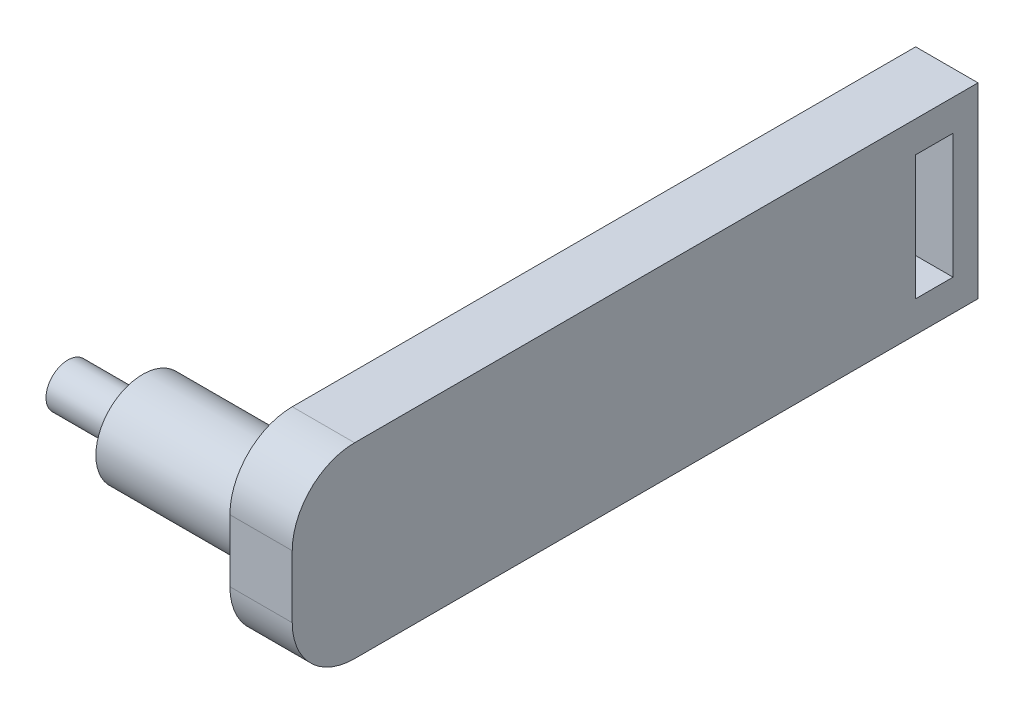
ISO-10303-21;
HEADER;
FILE_DESCRIPTION(('STEP AP214'),'2;1');
FILE_NAME('part.step','',(''),(''),'','','');
FILE_SCHEMA(('AUTOMOTIVE_DESIGN { 1 0 10303 214 1 1 1 1 }'));
ENDSEC;
DATA;
#1=APPLICATION_CONTEXT('core data for automotive mechanical design processes');
#2=APPLICATION_PROTOCOL_DEFINITION('international standard','automotive_design',2000,#1);
#3=PRODUCT_CONTEXT('',#1,'mechanical');
#4=PRODUCT('Part','Part','',(#3));
#5=PRODUCT_RELATED_PRODUCT_CATEGORY('part','',(#4));
#6=PRODUCT_DEFINITION_FORMATION('','',#4);
#7=PRODUCT_DEFINITION_CONTEXT('part definition',#1,'design');
#8=PRODUCT_DEFINITION('design','',#6,#7);
#9=PRODUCT_DEFINITION_SHAPE('','',#8);
#10=(LENGTH_UNIT() NAMED_UNIT(*) SI_UNIT(.MILLI.,.METRE.));
#11=(NAMED_UNIT(*) PLANE_ANGLE_UNIT() SI_UNIT($,.RADIAN.));
#12=(NAMED_UNIT(*) SI_UNIT($,.STERADIAN.) SOLID_ANGLE_UNIT());
#13=UNCERTAINTY_MEASURE_WITH_UNIT(LENGTH_MEASURE(1.E-05),#10,'distance_accuracy_value','');
#14=(GEOMETRIC_REPRESENTATION_CONTEXT(3) GLOBAL_UNCERTAINTY_ASSIGNED_CONTEXT((#13)) GLOBAL_UNIT_ASSIGNED_CONTEXT((#10,
#11,#12)) REPRESENTATION_CONTEXT('',''));
#15=CARTESIAN_POINT('',(0.,0.,0.));
#16=DIRECTION('',(0.,0.,1.));
#17=DIRECTION('',(1.,0.,0.));
#18=AXIS2_PLACEMENT_3D('',#15,#16,#17);
#19=CARTESIAN_POINT('',(0.,15.,26.2097315436242));
#20=DIRECTION('',(0.,0.,-1.));
#21=DIRECTION('',(-1.,0.,0.));
#22=AXIS2_PLACEMENT_3D('',#19,#20,#21);
#23=PLANE('',#22);
#24=DIRECTION('',(0.,-1.,0.));
#25=VECTOR('',#24,1.);
#26=CARTESIAN_POINT('',(-56.8805369127517,15.,26.2097315436242));
#27=LINE('',#26,#25);
#28=CARTESIAN_POINT('',(-56.8805369127517,10.,26.2097315436242));
#29=VERTEX_POINT('',#28);
#30=CARTESIAN_POINT('',(-56.8805369127517,5.,26.2097315436242));
#31=VERTEX_POINT('',#30);
#32=EDGE_CURVE('E191',#29,#31,#27,.T.);
#33=ORIENTED_EDGE('',*,*,#32,.F.);
#34=DIRECTION('',(1.,0.,0.));
#35=VECTOR('',#34,1.);
#36=CARTESIAN_POINT('',(-61.8805369127517,10.,26.2097315436242));
#37=LINE('',#36,#35);
#38=CARTESIAN_POINT('',(-61.8805369127517,10.,26.2097315436242));
#39=VERTEX_POINT('',#38);
#40=EDGE_CURVE('E209',#29,#39,#37,.F.);
#41=ORIENTED_EDGE('',*,*,#40,.T.);
#42=DIRECTION('',(0.,-1.,0.));
#43=VECTOR('',#42,1.);
#44=CARTESIAN_POINT('',(-61.8805369127517,15.,26.2097315436242));
#45=LINE('',#44,#43);
#46=CARTESIAN_POINT('',(-61.8805369127517,5.,26.2097315436242));
#47=VERTEX_POINT('',#46);
#48=EDGE_CURVE('E171',#39,#47,#45,.T.);
#49=ORIENTED_EDGE('',*,*,#48,.T.);
#50=DIRECTION('',(1.,0.,0.));
#51=VECTOR('',#50,1.);
#52=CARTESIAN_POINT('',(0.,5.,26.2097315436242));
#53=LINE('',#52,#51);
#54=EDGE_CURVE('E205',#47,#31,#53,.T.);
#55=ORIENTED_EDGE('',*,*,#54,.T.);
#56=EDGE_LOOP('',(#33,#41,#49,#55));
#57=FACE_BOUND('',#56,.T.);
#58=ADVANCED_FACE('F41',(#57),#23,.F.);
#59=CARTESIAN_POINT('',(-56.8805369127517,15.,0.));
#60=DIRECTION('',(-1.,0.,0.));
#61=DIRECTION('',(0.,0.,1.));
#62=AXIS2_PLACEMENT_3D('',#59,#60,#61);
#63=PLANE('',#62);
#64=DIRECTION('',(0.,0.,1.));
#65=VECTOR('',#64,1.);
#66=CARTESIAN_POINT('',(-56.8805369127517,12.5,-26.7902684563758));
#67=LINE('',#66,#65);
#68=CARTESIAN_POINT('',(-56.8805369127517,12.5,-26.7902684563758));
#69=VERTEX_POINT('',#68);
#70=CARTESIAN_POINT('',(-56.8805369127517,12.5,-23.7902684563758));
#71=VERTEX_POINT('',#70);
#72=EDGE_CURVE('E314',#69,#71,#67,.T.);
#73=ORIENTED_EDGE('',*,*,#72,.F.);
#74=DIRECTION('',(0.,1.,0.));
#75=VECTOR('',#74,1.);
#76=CARTESIAN_POINT('',(-56.8805369127517,2.5,-26.7902684563758));
#77=LINE('',#76,#75);
#78=CARTESIAN_POINT('',(-56.8805369127517,2.5,-26.7902684563758));
#79=VERTEX_POINT('',#78);
#80=EDGE_CURVE('E159',#79,#69,#77,.T.);
#81=ORIENTED_EDGE('',*,*,#80,.F.);
#82=DIRECTION('',(0.,0.,-1.));
#83=VECTOR('',#82,1.);
#84=CARTESIAN_POINT('',(-56.8805369127517,2.5,-26.7902684563758));
#85=LINE('',#84,#83);
#86=CARTESIAN_POINT('',(-56.8805369127517,2.5,-23.7902684563758));
#87=VERTEX_POINT('',#86);
#88=EDGE_CURVE('E155',#87,#79,#85,.T.);
#89=ORIENTED_EDGE('',*,*,#88,.F.);
#90=DIRECTION('',(0.,-1.,0.));
#91=VECTOR('',#90,1.);
#92=CARTESIAN_POINT('',(-56.8805369127517,2.5,-23.7902684563758));
#93=LINE('',#92,#91);
#94=EDGE_CURVE('E126',#71,#87,#93,.T.);
#95=ORIENTED_EDGE('',*,*,#94,.F.);
#96=EDGE_LOOP('',(#73,#81,#89,#95));
#97=FACE_BOUND('',#96,.T.);
#98=DIRECTION('',(0.,0.,-1.));
#99=VECTOR('',#98,1.);
#100=CARTESIAN_POINT('',(-56.8805369127517,15.,0.));
#101=LINE('',#100,#99);
#102=CARTESIAN_POINT('',(-56.8805369127517,15.,21.2097315436242));
#103=VERTEX_POINT('',#102);
#104=CARTESIAN_POINT('',(-56.8805369127517,15.,-28.7902684563758));
#105=VERTEX_POINT('',#104);
#106=EDGE_CURVE('E160',#103,#105,#101,.T.);
#107=ORIENTED_EDGE('',*,*,#106,.F.);
#108=CARTESIAN_POINT('',(-56.8805369127517,10.,21.2097315436242));
#109=DIRECTION('',(-1.,0.,0.));
#110=DIRECTION('',(0.,0.,1.));
#111=AXIS2_PLACEMENT_3D('',#108,#109,#110);
#112=CIRCLE('',#111,5.);
#113=EDGE_CURVE('E202',#103,#29,#112,.F.);
#114=ORIENTED_EDGE('',*,*,#113,.T.);
#115=ORIENTED_EDGE('',*,*,#32,.T.);
#116=CARTESIAN_POINT('',(-56.8805369127517,5.,21.2097315436242));
#117=DIRECTION('',(-1.,0.,0.));
#118=DIRECTION('',(0.,0.,1.));
#119=AXIS2_PLACEMENT_3D('',#116,#117,#118);
#120=CIRCLE('',#119,5.);
#121=CARTESIAN_POINT('',(-56.8805369127517,0.,21.2097315436242));
#122=VERTEX_POINT('',#121);
#123=EDGE_CURVE('E199',#31,#122,#120,.F.);
#124=ORIENTED_EDGE('',*,*,#123,.T.);
#125=DIRECTION('',(0.,0.,-1.));
#126=VECTOR('',#125,1.);
#127=CARTESIAN_POINT('',(-56.8805369127517,0.,0.));
#128=LINE('',#127,#126);
#129=CARTESIAN_POINT('',(-56.8805369127517,0.,-28.7902684563758));
#130=VERTEX_POINT('',#129);
#131=EDGE_CURVE('E158',#122,#130,#128,.T.);
#132=ORIENTED_EDGE('',*,*,#131,.T.);
#133=DIRECTION('',(0.,-1.,0.));
#134=VECTOR('',#133,1.);
#135=CARTESIAN_POINT('',(-56.8805369127517,15.,-28.7902684563758));
#136=LINE('',#135,#134);
#137=EDGE_CURVE('E187',#105,#130,#136,.T.);
#138=ORIENTED_EDGE('',*,*,#137,.F.);
#139=EDGE_LOOP('',(#107,#114,#115,#124,#132,#138));
#140=FACE_BOUND('',#139,.T.);
#141=ADVANCED_FACE('F235',(#97,#140),#63,.F.);
#142=CARTESIAN_POINT('',(0.,15.,-28.7902684563758));
#143=DIRECTION('',(0.,0.,-1.));
#144=DIRECTION('',(-1.,0.,0.));
#145=AXIS2_PLACEMENT_3D('',#142,#143,#144);
#146=PLANE('',#145);
#147=DIRECTION('',(1.,0.,0.));
#148=VECTOR('',#147,1.);
#149=CARTESIAN_POINT('',(0.,0.,-28.7902684563758));
#150=LINE('',#149,#148);
#151=CARTESIAN_POINT('',(-61.8805369127517,0.,-28.7902684563758));
#152=VERTEX_POINT('',#151);
#153=EDGE_CURVE('E174',#152,#130,#150,.T.);
#154=ORIENTED_EDGE('',*,*,#153,.F.);
#155=DIRECTION('',(0.,-1.,0.));
#156=VECTOR('',#155,1.);
#157=CARTESIAN_POINT('',(-61.8805369127517,15.,-28.7902684563758));
#158=LINE('',#157,#156);
#159=CARTESIAN_POINT('',(-61.8805369127517,15.,-28.7902684563758));
#160=VERTEX_POINT('',#159);
#161=EDGE_CURVE('E183',#160,#152,#158,.T.);
#162=ORIENTED_EDGE('',*,*,#161,.F.);
#163=DIRECTION('',(1.,0.,0.));
#164=VECTOR('',#163,1.);
#165=CARTESIAN_POINT('',(0.,15.,-28.7902684563758));
#166=LINE('',#165,#164);
#167=EDGE_CURVE('E163',#160,#105,#166,.T.);
#168=ORIENTED_EDGE('',*,*,#167,.T.);
#169=ORIENTED_EDGE('',*,*,#137,.T.);
#170=EDGE_LOOP('',(#154,#162,#168,#169));
#171=FACE_BOUND('',#170,.T.);
#172=ADVANCED_FACE('F244',(#171),#146,.T.);
#173=CARTESIAN_POINT('',(-61.8805369127517,15.,0.));
#174=DIRECTION('',(-1.,0.,0.));
#175=DIRECTION('',(0.,0.,1.));
#176=AXIS2_PLACEMENT_3D('',#173,#174,#175);
#177=PLANE('',#176);
#178=CARTESIAN_POINT('',(-61.8805369127517,7.5,21.2097315436242));
#179=DIRECTION('',(-1.,0.,0.));
#180=DIRECTION('',(0.,0.,1.));
#181=AXIS2_PLACEMENT_3D('',#178,#179,#180);
#182=CIRCLE('',#181,3.75);
#183=CARTESIAN_POINT('',(-61.8805369127517,7.5,24.9597315436242));
#184=VERTEX_POINT('',#183);
#185=EDGE_CURVE('E302',#184,#184,#182,.T.);
#186=ORIENTED_EDGE('',*,*,#185,.F.);
#187=EDGE_LOOP('',(#186));
#188=FACE_BOUND('',#187,.T.);
#189=DIRECTION('',(0.,-1.,0.));
#190=VECTOR('',#189,1.);
#191=CARTESIAN_POINT('',(-61.8805369127517,2.5,-26.7902684563758));
#192=LINE('',#191,#190);
#193=CARTESIAN_POINT('',(-61.8805369127517,12.5,-26.7902684563758));
#194=VERTEX_POINT('',#193);
#195=CARTESIAN_POINT('',(-61.8805369127517,2.5,-26.7902684563758));
#196=VERTEX_POINT('',#195);
#197=EDGE_CURVE('E66',#194,#196,#192,.T.);
#198=ORIENTED_EDGE('',*,*,#197,.F.);
#199=DIRECTION('',(0.,0.,-1.));
#200=VECTOR('',#199,1.);
#201=CARTESIAN_POINT('',(-61.8805369127517,12.5,-26.7902684563758));
#202=LINE('',#201,#200);
#203=CARTESIAN_POINT('',(-61.8805369127517,12.5,-23.7902684563758));
#204=VERTEX_POINT('',#203);
#205=EDGE_CURVE('E141',#204,#194,#202,.T.);
#206=ORIENTED_EDGE('',*,*,#205,.F.);
#207=DIRECTION('',(0.,1.,0.));
#208=VECTOR('',#207,1.);
#209=CARTESIAN_POINT('',(-61.8805369127517,2.5,-23.7902684563758));
#210=LINE('',#209,#208);
#211=CARTESIAN_POINT('',(-61.8805369127517,2.5,-23.7902684563758));
#212=VERTEX_POINT('',#211);
#213=EDGE_CURVE('E123',#212,#204,#210,.T.);
#214=ORIENTED_EDGE('',*,*,#213,.F.);
#215=DIRECTION('',(0.,0.,1.));
#216=VECTOR('',#215,1.);
#217=CARTESIAN_POINT('',(-61.8805369127517,2.5,-26.7902684563758));
#218=LINE('',#217,#216);
#219=EDGE_CURVE('E133',#196,#212,#218,.T.);
#220=ORIENTED_EDGE('',*,*,#219,.F.);
#221=EDGE_LOOP('',(#198,#206,#214,#220));
#222=FACE_BOUND('',#221,.T.);
#223=ORIENTED_EDGE('',*,*,#48,.F.);
#224=CARTESIAN_POINT('',(-61.8805369127517,10.,21.2097315436242));
#225=DIRECTION('',(-1.,0.,0.));
#226=DIRECTION('',(0.,0.,1.));
#227=AXIS2_PLACEMENT_3D('',#224,#225,#226);
#228=CIRCLE('',#227,5.);
#229=CARTESIAN_POINT('',(-61.8805369127517,15.,21.2097315436242));
#230=VERTEX_POINT('',#229);
#231=EDGE_CURVE('E214',#39,#230,#228,.T.);
#232=ORIENTED_EDGE('',*,*,#231,.T.);
#233=DIRECTION('',(0.,0.,-1.));
#234=VECTOR('',#233,1.);
#235=CARTESIAN_POINT('',(-61.8805369127517,15.,0.));
#236=LINE('',#235,#234);
#237=EDGE_CURVE('E168',#230,#160,#236,.T.);
#238=ORIENTED_EDGE('',*,*,#237,.T.);
#239=ORIENTED_EDGE('',*,*,#161,.T.);
#240=DIRECTION('',(0.,0.,-1.));
#241=VECTOR('',#240,1.);
#242=CARTESIAN_POINT('',(-61.8805369127517,0.,0.));
#243=LINE('',#242,#241);
#244=CARTESIAN_POINT('',(-61.8805369127517,0.,21.2097315436242));
#245=VERTEX_POINT('',#244);
#246=EDGE_CURVE('E164',#245,#152,#243,.T.);
#247=ORIENTED_EDGE('',*,*,#246,.F.);
#248=CARTESIAN_POINT('',(-61.8805369127517,5.,21.2097315436242));
#249=DIRECTION('',(-1.,0.,0.));
#250=DIRECTION('',(0.,0.,1.));
#251=AXIS2_PLACEMENT_3D('',#248,#249,#250);
#252=CIRCLE('',#251,5.);
#253=EDGE_CURVE('E212',#245,#47,#252,.T.);
#254=ORIENTED_EDGE('',*,*,#253,.T.);
#255=EDGE_LOOP('',(#223,#232,#238,#239,#247,#254));
#256=FACE_BOUND('',#255,.T.);
#257=ADVANCED_FACE('F138',(#188,#222,#256),#177,.T.);
#258=CARTESIAN_POINT('',(0.,15.,0.));
#259=DIRECTION('',(0.,1.,0.));
#260=DIRECTION('',(0.,0.,1.));
#261=AXIS2_PLACEMENT_3D('',#258,#259,#260);
#262=PLANE('',#261);
#263=ORIENTED_EDGE('',*,*,#237,.F.);
#264=DIRECTION('',(1.,0.,0.));
#265=VECTOR('',#264,1.);
#266=CARTESIAN_POINT('',(-56.8805369127517,15.,21.2097315436242));
#267=LINE('',#266,#265);
#268=EDGE_CURVE('E195',#230,#103,#267,.T.);
#269=ORIENTED_EDGE('',*,*,#268,.T.);
#270=ORIENTED_EDGE('',*,*,#106,.T.);
#271=ORIENTED_EDGE('',*,*,#167,.F.);
#272=EDGE_LOOP('',(#263,#269,#270,#271));
#273=FACE_BOUND('',#272,.T.);
#274=ADVANCED_FACE('F241',(#273),#262,.T.);
#275=CARTESIAN_POINT('',(0.,0.,0.));
#276=DIRECTION('',(0.,1.,0.));
#277=DIRECTION('',(0.,0.,1.));
#278=AXIS2_PLACEMENT_3D('',#275,#276,#277);
#279=PLANE('',#278);
#280=ORIENTED_EDGE('',*,*,#131,.F.);
#281=DIRECTION('',(1.,0.,0.));
#282=VECTOR('',#281,1.);
#283=CARTESIAN_POINT('',(0.,0.,21.2097315436242));
#284=LINE('',#283,#282);
#285=EDGE_CURVE('E45',#122,#245,#284,.F.);
#286=ORIENTED_EDGE('',*,*,#285,.T.);
#287=ORIENTED_EDGE('',*,*,#246,.T.);
#288=ORIENTED_EDGE('',*,*,#153,.T.);
#289=EDGE_LOOP('',(#280,#286,#287,#288));
#290=FACE_BOUND('',#289,.T.);
#291=ADVANCED_FACE('F224',(#290),#279,.F.);
#292=CARTESIAN_POINT('',(0.,10.,21.2097315436242));
#293=DIRECTION('',(-1.,0.,0.));
#294=DIRECTION('',(0.,0.,1.));
#295=AXIS2_PLACEMENT_3D('',#292,#293,#294);
#296=CYLINDRICAL_SURFACE('',#295,5.);
#297=ORIENTED_EDGE('',*,*,#231,.F.);
#298=ORIENTED_EDGE('',*,*,#40,.F.);
#299=ORIENTED_EDGE('',*,*,#113,.F.);
#300=ORIENTED_EDGE('',*,*,#268,.F.);
#301=EDGE_LOOP('',(#297,#298,#299,#300));
#302=FACE_BOUND('',#301,.T.);
#303=ADVANCED_FACE('F239',(#302),#296,.T.);
#304=CARTESIAN_POINT('',(0.,5.,21.2097315436242));
#305=DIRECTION('',(1.,0.,0.));
#306=DIRECTION('',(0.,0.,-1.));
#307=AXIS2_PLACEMENT_3D('',#304,#305,#306);
#308=CYLINDRICAL_SURFACE('',#307,5.);
#309=ORIENTED_EDGE('',*,*,#253,.F.);
#310=ORIENTED_EDGE('',*,*,#285,.F.);
#311=ORIENTED_EDGE('',*,*,#123,.F.);
#312=ORIENTED_EDGE('',*,*,#54,.F.);
#313=EDGE_LOOP('',(#309,#310,#311,#312));
#314=FACE_BOUND('',#313,.T.);
#315=ADVANCED_FACE('F43',(#314),#308,.T.);
#316=CARTESIAN_POINT('',(-46.4402304038411,2.5,-26.7902684563758));
#317=DIRECTION('',(0.,0.,-1.));
#318=DIRECTION('',(-1.,0.,0.));
#319=AXIS2_PLACEMENT_3D('',#316,#317,#318);
#320=PLANE('',#319);
#321=ORIENTED_EDGE('',*,*,#80,.T.);
#322=DIRECTION('',(-1.,0.,0.));
#323=VECTOR('',#322,1.);
#324=CARTESIAN_POINT('',(-46.4402304038411,12.5,-26.7902684563758));
#325=LINE('',#324,#323);
#326=EDGE_CURVE('E148',#69,#194,#325,.T.);
#327=ORIENTED_EDGE('',*,*,#326,.T.);
#328=ORIENTED_EDGE('',*,*,#197,.T.);
#329=DIRECTION('',(-1.,0.,0.));
#330=VECTOR('',#329,1.);
#331=CARTESIAN_POINT('',(-46.4402304038411,2.5,-26.7902684563758));
#332=LINE('',#331,#330);
#333=EDGE_CURVE('E130',#79,#196,#332,.T.);
#334=ORIENTED_EDGE('',*,*,#333,.F.);
#335=EDGE_LOOP('',(#321,#327,#328,#334));
#336=FACE_BOUND('',#335,.T.);
#337=ADVANCED_FACE('F264',(#336),#320,.F.);
#338=CARTESIAN_POINT('',(-46.4402304038411,12.5,-26.7902684563758));
#339=DIRECTION('',(0.,1.,0.));
#340=DIRECTION('',(0.,0.,1.));
#341=AXIS2_PLACEMENT_3D('',#338,#339,#340);
#342=PLANE('',#341);
#343=ORIENTED_EDGE('',*,*,#72,.T.);
#344=DIRECTION('',(-1.,0.,0.));
#345=VECTOR('',#344,1.);
#346=CARTESIAN_POINT('',(-46.4402304038411,12.5,-23.7902684563758));
#347=LINE('',#346,#345);
#348=EDGE_CURVE('E129',#71,#204,#347,.T.);
#349=ORIENTED_EDGE('',*,*,#348,.T.);
#350=ORIENTED_EDGE('',*,*,#205,.T.);
#351=ORIENTED_EDGE('',*,*,#326,.F.);
#352=EDGE_LOOP('',(#343,#349,#350,#351));
#353=FACE_BOUND('',#352,.T.);
#354=ADVANCED_FACE('F273',(#353),#342,.F.);
#355=CARTESIAN_POINT('',(-46.4402304038411,2.5,-23.7902684563758));
#356=DIRECTION('',(0.,0.,1.));
#357=DIRECTION('',(1.,0.,0.));
#358=AXIS2_PLACEMENT_3D('',#355,#356,#357);
#359=PLANE('',#358);
#360=ORIENTED_EDGE('',*,*,#94,.T.);
#361=DIRECTION('',(-1.,0.,0.));
#362=VECTOR('',#361,1.);
#363=CARTESIAN_POINT('',(-46.4402304038411,2.5,-23.7902684563758));
#364=LINE('',#363,#362);
#365=EDGE_CURVE('E58',#87,#212,#364,.T.);
#366=ORIENTED_EDGE('',*,*,#365,.T.);
#367=ORIENTED_EDGE('',*,*,#213,.T.);
#368=ORIENTED_EDGE('',*,*,#348,.F.);
#369=EDGE_LOOP('',(#360,#366,#367,#368));
#370=FACE_BOUND('',#369,.T.);
#371=ADVANCED_FACE('F120',(#370),#359,.F.);
#372=CARTESIAN_POINT('',(-46.4402304038411,2.5,-26.7902684563758));
#373=DIRECTION('',(0.,-1.,0.));
#374=DIRECTION('',(0.,0.,-1.));
#375=AXIS2_PLACEMENT_3D('',#372,#373,#374);
#376=PLANE('',#375);
#377=ORIENTED_EDGE('',*,*,#88,.T.);
#378=ORIENTED_EDGE('',*,*,#333,.T.);
#379=ORIENTED_EDGE('',*,*,#219,.T.);
#380=ORIENTED_EDGE('',*,*,#365,.F.);
#381=EDGE_LOOP('',(#377,#378,#379,#380));
#382=FACE_BOUND('',#381,.T.);
#383=ADVANCED_FACE('F134',(#382),#376,.F.);
#384=CARTESIAN_POINT('',(-73.8805369127517,7.5,21.2097315436242));
#385=DIRECTION('',(1.,0.,0.));
#386=DIRECTION('',(0.,0.,-1.));
#387=AXIS2_PLACEMENT_3D('',#384,#385,#386);
#388=CYLINDRICAL_SURFACE('',#387,3.75);
#389=CARTESIAN_POINT('',(-73.8805369127517,7.5,21.2097315436242));
#390=DIRECTION('',(-1.,0.,0.));
#391=DIRECTION('',(0.,0.,1.));
#392=AXIS2_PLACEMENT_3D('',#389,#390,#391);
#393=CIRCLE('',#392,3.75);
#394=CARTESIAN_POINT('',(-73.8805369127517,7.5,24.9597315436242));
#395=VERTEX_POINT('',#394);
#396=EDGE_CURVE('E306',#395,#395,#393,.T.);
#397=ORIENTED_EDGE('',*,*,#396,.F.);
#398=EDGE_LOOP('',(#397));
#399=FACE_BOUND('',#398,.T.);
#400=ORIENTED_EDGE('',*,*,#185,.T.);
#401=EDGE_LOOP('',(#400));
#402=FACE_BOUND('',#401,.T.);
#403=ADVANCED_FACE('F276',(#399,#402),#388,.T.);
#404=CARTESIAN_POINT('',(-73.8805369127517,7.5,21.2097315436242));
#405=DIRECTION('',(-1.,0.,0.));
#406=DIRECTION('',(0.,0.,1.));
#407=AXIS2_PLACEMENT_3D('',#404,#405,#406);
#408=PLANE('',#407);
#409=CARTESIAN_POINT('',(-73.8805369127517,7.5,21.2097315436242));
#410=DIRECTION('',(-1.,0.,0.));
#411=DIRECTION('',(0.,0.,1.));
#412=AXIS2_PLACEMENT_3D('',#409,#410,#411);
#413=CIRCLE('',#412,1.75);
#414=CARTESIAN_POINT('',(-73.8805369127517,7.5,22.9597315436242));
#415=VERTEX_POINT('',#414);
#416=EDGE_CURVE('E11',#415,#415,#413,.T.);
#417=ORIENTED_EDGE('',*,*,#416,.F.);
#418=EDGE_LOOP('',(#417));
#419=FACE_BOUND('',#418,.T.);
#420=ORIENTED_EDGE('',*,*,#396,.T.);
#421=EDGE_LOOP('',(#420));
#422=FACE_BOUND('',#421,.T.);
#423=ADVANCED_FACE('F284',(#419,#422),#408,.T.);
#424=CARTESIAN_POINT('',(-79.8805369127517,7.5,21.2097315436242));
#425=DIRECTION('',(1.,0.,0.));
#426=DIRECTION('',(0.,0.,-1.));
#427=AXIS2_PLACEMENT_3D('',#424,#425,#426);
#428=CYLINDRICAL_SURFACE('',#427,1.75);
#429=CARTESIAN_POINT('',(-79.8805369127517,7.5,21.2097315436242));
#430=DIRECTION('',(-1.,0.,0.));
#431=DIRECTION('',(0.,0.,1.));
#432=AXIS2_PLACEMENT_3D('',#429,#430,#431);
#433=CIRCLE('',#432,1.75);
#434=CARTESIAN_POINT('',(-79.8805369127517,7.5,22.9597315436242));
#435=VERTEX_POINT('',#434);
#436=EDGE_CURVE('E300',#435,#435,#433,.T.);
#437=ORIENTED_EDGE('',*,*,#436,.F.);
#438=EDGE_LOOP('',(#437));
#439=FACE_BOUND('',#438,.T.);
#440=ORIENTED_EDGE('',*,*,#416,.T.);
#441=EDGE_LOOP('',(#440));
#442=FACE_BOUND('',#441,.T.);
#443=ADVANCED_FACE('F288',(#439,#442),#428,.T.);
#444=CARTESIAN_POINT('',(-79.8805369127517,7.5,21.2097315436242));
#445=DIRECTION('',(-1.,0.,0.));
#446=DIRECTION('',(0.,0.,1.));
#447=AXIS2_PLACEMENT_3D('',#444,#445,#446);
#448=PLANE('',#447);
#449=ORIENTED_EDGE('',*,*,#436,.T.);
#450=EDGE_LOOP('',(#449));
#451=FACE_BOUND('',#450,.T.);
#452=ADVANCED_FACE('F292',(#451),#448,.T.);
#453=CLOSED_SHELL('',(#58,#141,#172,#257,#274,#291,#303,#315,#337,#354,#371,#383,#403,#423,#443,#452));
#454=MANIFOLD_SOLID_BREP('B2',#453);
#455=ADVANCED_BREP_SHAPE_REPRESENTATION('',(#18,#454),#14);
#456=SHAPE_DEFINITION_REPRESENTATION(#9,#455);
ENDSEC;
END-ISO-10303-21;
